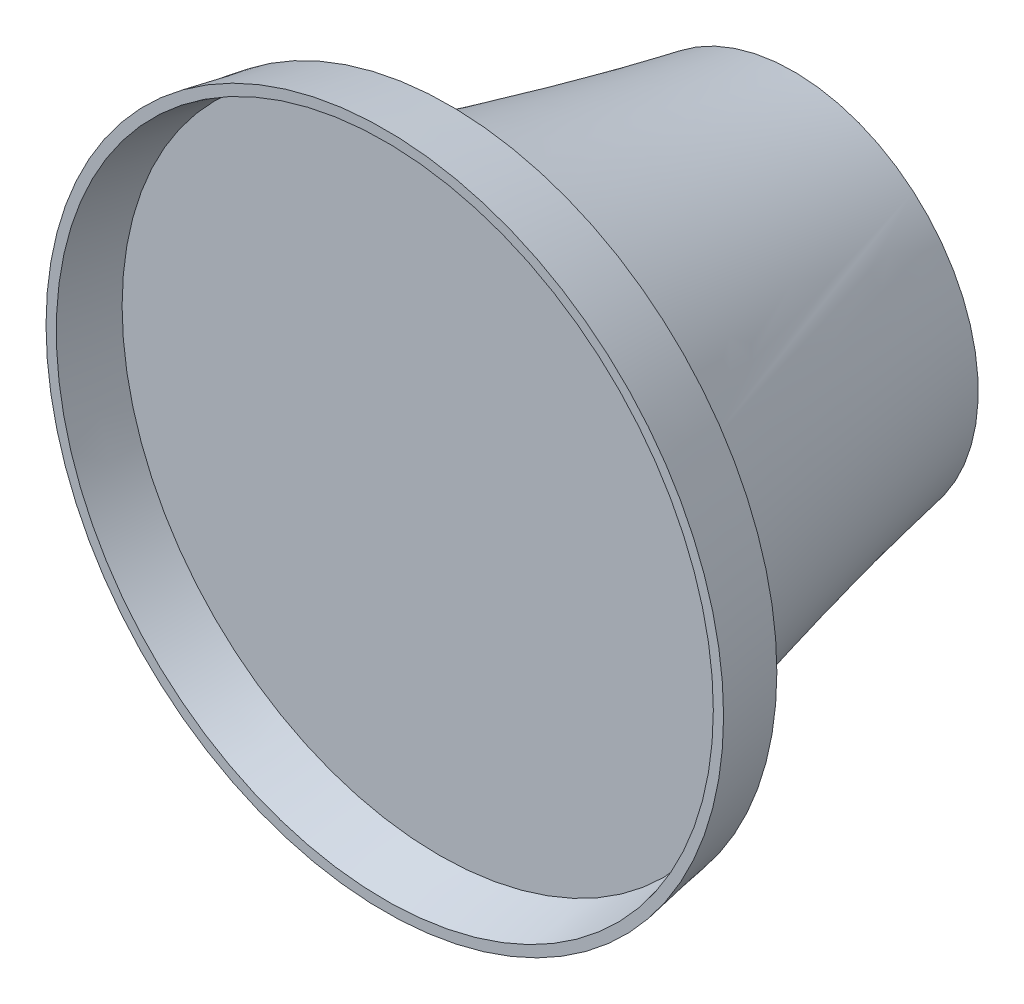
ISO-10303-21;
HEADER;
FILE_DESCRIPTION(('STEP AP214'),'2;1');
FILE_NAME('part.step','',(''),(''),'','','');
FILE_SCHEMA(('AUTOMOTIVE_DESIGN { 1 0 10303 214 1 1 1 1 }'));
ENDSEC;
DATA;
#1=APPLICATION_CONTEXT('core data for automotive mechanical design processes');
#2=APPLICATION_PROTOCOL_DEFINITION('international standard','automotive_design',2000,#1);
#3=PRODUCT_CONTEXT('',#1,'mechanical');
#4=PRODUCT('Part','Part','',(#3));
#5=PRODUCT_RELATED_PRODUCT_CATEGORY('part','',(#4));
#6=PRODUCT_DEFINITION_FORMATION('','',#4);
#7=PRODUCT_DEFINITION_CONTEXT('part definition',#1,'design');
#8=PRODUCT_DEFINITION('design','',#6,#7);
#9=PRODUCT_DEFINITION_SHAPE('','',#8);
#10=(LENGTH_UNIT() NAMED_UNIT(*) SI_UNIT(.MILLI.,.METRE.));
#11=(NAMED_UNIT(*) PLANE_ANGLE_UNIT() SI_UNIT($,.RADIAN.));
#12=(NAMED_UNIT(*) SI_UNIT($,.STERADIAN.) SOLID_ANGLE_UNIT());
#13=UNCERTAINTY_MEASURE_WITH_UNIT(LENGTH_MEASURE(1.E-05),#10,'distance_accuracy_value','');
#14=(GEOMETRIC_REPRESENTATION_CONTEXT(3) GLOBAL_UNCERTAINTY_ASSIGNED_CONTEXT((#13)) GLOBAL_UNIT_ASSIGNED_CONTEXT((#10,
#11,#12)) REPRESENTATION_CONTEXT('',''));
#15=CARTESIAN_POINT('',(0.,0.,0.));
#16=DIRECTION('',(0.,0.,1.));
#17=DIRECTION('',(1.,0.,0.));
#18=AXIS2_PLACEMENT_3D('',#15,#16,#17);
#19=CARTESIAN_POINT('',(-33.,0.,0.));
#20=DIRECTION('',(0.,0.,-1.));
#21=DIRECTION('',(-1.,0.,0.));
#22=AXIS2_PLACEMENT_3D('',#19,#20,#21);
#23=PLANE('',#22);
#24=CARTESIAN_POINT('',(0.,0.,0.));
#25=DIRECTION('',(0.,0.,1.));
#26=DIRECTION('',(1.,0.,0.));
#27=AXIS2_PLACEMENT_3D('',#24,#25,#26);
#28=CIRCLE('',#27,32.);
#29=CARTESIAN_POINT('',(32.,0.,0.));
#30=VERTEX_POINT('',#29);
#31=EDGE_CURVE('E65',#30,#30,#28,.T.);
#32=ORIENTED_EDGE('',*,*,#31,.F.);
#33=EDGE_LOOP('',(#32));
#34=FACE_BOUND('',#33,.T.);
#35=CARTESIAN_POINT('',(0.,0.,0.));
#36=DIRECTION('',(0.,0.,1.));
#37=DIRECTION('',(1.,0.,0.));
#38=AXIS2_PLACEMENT_3D('',#35,#36,#37);
#39=CIRCLE('',#38,33.);
#40=CARTESIAN_POINT('',(33.,0.,0.));
#41=VERTEX_POINT('',#40);
#42=EDGE_CURVE('E53',#41,#41,#39,.T.);
#43=ORIENTED_EDGE('',*,*,#42,.T.);
#44=EDGE_LOOP('',(#43));
#45=FACE_BOUND('',#44,.T.);
#46=ADVANCED_FACE('F45',(#34,#45),#23,.F.);
#47=CARTESIAN_POINT('',(0.,0.,-6.3));
#48=DIRECTION('',(0.,0.,1.));
#49=DIRECTION('',(1.,0.,0.));
#50=AXIS2_PLACEMENT_3D('',#47,#48,#49);
#51=CONICAL_SURFACE('',#50,31.8891400215367,0.17453292519943);
#52=ORIENTED_EDGE('',*,*,#42,.F.);
#53=EDGE_LOOP('',(#52));
#54=FACE_BOUND('',#53,.T.);
#55=CARTESIAN_POINT('',(0.,0.,-6.3));
#56=DIRECTION('',(0.,0.,1.));
#57=DIRECTION('',(1.,0.,0.));
#58=AXIS2_PLACEMENT_3D('',#55,#56,#57);
#59=CIRCLE('',#58,31.8891400215367);
#60=CARTESIAN_POINT('',(31.8891400215367,0.,-6.3));
#61=VERTEX_POINT('',#60);
#62=EDGE_CURVE('E59',#61,#61,#59,.T.);
#63=ORIENTED_EDGE('',*,*,#62,.T.);
#64=EDGE_LOOP('',(#63));
#65=FACE_BOUND('',#64,.T.);
#66=ADVANCED_FACE('F134',(#54,#65),#51,.T.);
#67=CARTESIAN_POINT('',(-30.8891400215367,0.,-6.3));
#68=DIRECTION('',(0.,0.,1.));
#69=DIRECTION('',(1.,0.,0.));
#70=AXIS2_PLACEMENT_3D('',#67,#68,#69);
#71=PLANE('',#70);
#72=CARTESIAN_POINT('',(0.,0.,-6.3));
#73=DIRECTION('',(0.,0.,-1.));
#74=DIRECTION('',(-1.,0.,0.));
#75=AXIS2_PLACEMENT_3D('',#72,#73,#74);
#76=CIRCLE('',#75,25.05);
#77=CARTESIAN_POINT('',(-25.05,0.,-6.3));
#78=VERTEX_POINT('',#77);
#79=EDGE_CURVE('E11',#78,#78,#76,.T.);
#80=ORIENTED_EDGE('',*,*,#79,.F.);
#81=EDGE_LOOP('',(#80));
#82=FACE_BOUND('',#81,.T.);
#83=ORIENTED_EDGE('',*,*,#62,.F.);
#84=EDGE_LOOP('',(#83));
#85=FACE_BOUND('',#84,.T.);
#86=ADVANCED_FACE('F131',(#82,#85),#71,.F.);
#87=CARTESIAN_POINT('',(0.,0.,-5.3));
#88=DIRECTION('',(0.,0.,-1.));
#89=DIRECTION('',(-1.,0.,0.));
#90=AXIS2_PLACEMENT_3D('',#87,#88,#89);
#91=PLANE('',#90);
#92=CARTESIAN_POINT('',(0.,0.,-5.3));
#93=DIRECTION('',(0.,0.,1.));
#94=DIRECTION('',(1.,0.,0.));
#95=AXIS2_PLACEMENT_3D('',#92,#93,#94);
#96=CIRCLE('',#95,30.8891400215367);
#97=CARTESIAN_POINT('',(30.8891400215367,0.,-5.3));
#98=VERTEX_POINT('',#97);
#99=EDGE_CURVE('E69',#98,#98,#96,.T.);
#100=ORIENTED_EDGE('',*,*,#99,.T.);
#101=EDGE_LOOP('',(#100));
#102=FACE_BOUND('',#101,.T.);
#103=ADVANCED_FACE('F127',(#102),#91,.F.);
#104=CARTESIAN_POINT('',(0.,0.,0.));
#105=DIRECTION('',(0.,0.,1.));
#106=DIRECTION('',(1.,0.,0.));
#107=AXIS2_PLACEMENT_3D('',#104,#105,#106);
#108=CONICAL_SURFACE('',#107,32.,0.206605439672846);
#109=ORIENTED_EDGE('',*,*,#99,.F.);
#110=EDGE_LOOP('',(#109));
#111=FACE_BOUND('',#110,.T.);
#112=ORIENTED_EDGE('',*,*,#31,.T.);
#113=EDGE_LOOP('',(#112));
#114=FACE_BOUND('',#113,.T.);
#115=ADVANCED_FACE('F123',(#111,#114),#108,.F.);
#116=CARTESIAN_POINT('',(0.,0.,-9.8));
#117=DIRECTION('',(0.,0.,1.));
#118=DIRECTION('',(1.,0.,0.));
#119=AXIS2_PLACEMENT_3D('',#116,#117,#118);
#120=CYLINDRICAL_SURFACE('',#119,25.05);
#121=CARTESIAN_POINT('',(0.,0.,-9.8));
#122=DIRECTION('',(0.,0.,1.));
#123=DIRECTION('',(1.,0.,0.));
#124=AXIS2_PLACEMENT_3D('',#121,#122,#123);
#125=CIRCLE('',#124,25.05);
#126=CARTESIAN_POINT('',(21.7747986758984,12.3838864103355,-9.8));
#127=VERTEX_POINT('',#126);
#128=EDGE_CURVE('E70',#127,#127,#125,.F.);
#129=ORIENTED_EDGE('',*,*,#128,.F.);
#130=EDGE_LOOP('',(#129));
#131=FACE_BOUND('',#130,.T.);
#132=ORIENTED_EDGE('',*,*,#79,.T.);
#133=EDGE_LOOP('',(#132));
#134=FACE_BOUND('',#133,.T.);
#135=ADVANCED_FACE('F101',(#131,#134),#120,.T.);
#136=CARTESIAN_POINT('',(0.,0.,-39.8));
#137=DIRECTION('',(0.,0.,-1.));
#138=DIRECTION('',(-1.,0.,0.));
#139=AXIS2_PLACEMENT_3D('',#136,#137,#138);
#140=PLANE('',#139);
#141=CARTESIAN_POINT('',(0.,0.,-39.8));
#142=DIRECTION('',(0.,0.,-1.));
#143=DIRECTION('',(-1.,0.,0.));
#144=AXIS2_PLACEMENT_3D('',#141,#142,#143);
#145=CIRCLE('',#144,18.);
#146=CARTESIAN_POINT('',(11.6642441509018,13.7093183050126,-39.8));
#147=VERTEX_POINT('',#146);
#148=EDGE_CURVE('E78',#147,#147,#145,.T.);
#149=ORIENTED_EDGE('',*,*,#148,.T.);
#150=EDGE_LOOP('',(#149));
#151=FACE_BOUND('',#150,.T.);
#152=ADVANCED_FACE('F91',(#151),#140,.T.);
#153=CARTESIAN_POINT('',(11.6642441509018,13.7093183050126,-39.8));
#154=CARTESIAN_POINT('',(21.7747986758984,12.3838864103355,-9.8));
#155=CARTESIAN_POINT('',(-15.7543924591234,37.0378066068161,-39.8));
#156=CARTESIAN_POINT('',(-2.99297414477261,55.9334837621323,-9.8));
#157=CARTESIAN_POINT('',(-39.082880760927,9.61916999679093,-39.8));
#158=CARTESIAN_POINT('',(-46.5425714965694,31.1657109414613,-9.8));
#159=CARTESIAN_POINT('',(-11.6642441509018,-13.7093183050126,-39.8));
#160=CARTESIAN_POINT('',(-21.7747986758984,-12.3838864103355,-9.8));
#161=CARTESIAN_POINT('',(15.7543924591234,-37.0378066068161,-39.8));
#162=CARTESIAN_POINT('',(2.99297414477263,-55.9334837621324,-9.8));
#163=CARTESIAN_POINT('',(39.0828807609269,-9.61916999679095,-39.8));
#164=CARTESIAN_POINT('',(46.5425714965695,-31.1657109414613,-9.8));
#165=CARTESIAN_POINT('',(11.6642441509018,13.7093183050126,-39.8));
#166=CARTESIAN_POINT('',(21.7747986758984,12.3838864103355,-9.8));
#167=(BOUNDED_SURFACE() B_SPLINE_SURFACE(3,1,((#153,#154),(#155,#156),(#157,#158),(#159,#160),
(#161,#162),(#163,#164),(#165,#166)),.UNSPECIFIED.,.T.,.F.,.F.) B_SPLINE_SURFACE_WITH_KNOTS((4,
3,4),(2,2),(0.,0.5,1.),(0.,1.),
.UNSPECIFIED.) GEOMETRIC_REPRESENTATION_ITEM() RATIONAL_B_SPLINE_SURFACE(((1.,1.),
(0.333333333333333,0.333333333333333),(0.333333333333333,0.333333333333333),(1.,1.),
(0.333333333333334,0.333333333333333),(0.333333333333334,0.333333333333333),(1.,1.))) REPRESENTATION_ITEM('') SURFACE());
#168=CARTESIAN_POINT('',(11.6642441509018,13.7093183050126,-39.8));
#169=CARTESIAN_POINT('',(11.7695624272038,13.6955117227764,-39.4875));
#170=CARTESIAN_POINT('',(11.8748807035059,13.6817051405402,-39.175));
#171=CARTESIAN_POINT('',(12.08551725611,13.6540919760677,-38.55));
#172=CARTESIAN_POINT('',(12.190835532412,13.6402853938315,-38.2375));
#173=CARTESIAN_POINT('',(12.4014720850161,13.6126722293591,-37.6125));
#174=CARTESIAN_POINT('',(12.5067903613182,13.5988656471228,-37.3));
#175=CARTESIAN_POINT('',(12.7174269139223,13.5712524826504,-36.675));
#176=CARTESIAN_POINT('',(12.8227451902243,13.5574459004142,-36.3625));
#177=CARTESIAN_POINT('',(13.0333817428284,13.5298327359418,-35.7375));
#178=CARTESIAN_POINT('',(13.1387000191304,13.5160261537055,-35.425));
#179=CARTESIAN_POINT('',(13.3493365717345,13.4884129892331,-34.8));
#180=CARTESIAN_POINT('',(13.4546548480366,13.4746064069969,-34.4875));
#181=CARTESIAN_POINT('',(13.6652914006407,13.4469932425244,-33.8625));
#182=CARTESIAN_POINT('',(13.7706096769427,13.4331866602882,-33.55));
#183=CARTESIAN_POINT('',(13.9812462295468,13.4055734958158,-32.925));
#184=CARTESIAN_POINT('',(14.0865645058489,13.3917669135796,-32.6125));
#185=CARTESIAN_POINT('',(14.297201058453,13.3641537491071,-31.9875));
#186=CARTESIAN_POINT('',(14.402519334755,13.3503471668709,-31.675));
#187=CARTESIAN_POINT('',(14.6131558873591,13.3227340023985,-31.05));
#188=CARTESIAN_POINT('',(14.7184741636612,13.3089274201622,-30.7375));
#189=CARTESIAN_POINT('',(14.9291107162653,13.2813142556898,-30.1125));
#190=CARTESIAN_POINT('',(15.0344289925673,13.2675076734536,-29.8));
#191=CARTESIAN_POINT('',(15.2450655451714,13.2398945089811,-29.175));
#192=CARTESIAN_POINT('',(15.3503838214735,13.2260879267449,-28.8625));
#193=CARTESIAN_POINT('',(15.5610203740776,13.1984747622725,-28.2375));
#194=CARTESIAN_POINT('',(15.6663386503796,13.1846681800363,-27.925));
#195=CARTESIAN_POINT('',(15.8769752029837,13.1570550155638,-27.3));
#196=CARTESIAN_POINT('',(15.9822934792858,13.1432484333276,-26.9875));
#197=CARTESIAN_POINT('',(16.1929300318899,13.1156352688552,-26.3625));
#198=CARTESIAN_POINT('',(16.2982483081919,13.1018286866189,-26.05));
#199=CARTESIAN_POINT('',(16.508884860796,13.0742155221465,-25.425));
#200=CARTESIAN_POINT('',(16.614203137098,13.0604089399103,-25.1125));
#201=CARTESIAN_POINT('',(16.8248396897021,13.0327957754378,-24.4875));
#202=CARTESIAN_POINT('',(16.9301579660042,13.0189891932016,-24.175));
#203=CARTESIAN_POINT('',(17.1407945186083,12.9913760287292,-23.55));
#204=CARTESIAN_POINT('',(17.2461127949103,12.977569446493,-23.2375));
#205=CARTESIAN_POINT('',(17.4567493475144,12.9499562820205,-22.6125));
#206=CARTESIAN_POINT('',(17.5620676238165,12.9361496997843,-22.3));
#207=CARTESIAN_POINT('',(17.7727041764206,12.9085365353119,-21.675));
#208=CARTESIAN_POINT('',(17.8780224527226,12.8947299530756,-21.3625));
#209=CARTESIAN_POINT('',(18.0886590053267,12.8671167886032,-20.7375));
#210=CARTESIAN_POINT('',(18.1939772816288,12.853310206367,-20.425));
#211=CARTESIAN_POINT('',(18.4046138342329,12.8256970418945,-19.8));
#212=CARTESIAN_POINT('',(18.5099321105349,12.8118904596583,-19.4875));
#213=CARTESIAN_POINT('',(18.720568663139,12.7842772951859,-18.8625));
#214=CARTESIAN_POINT('',(18.8258869394411,12.7704707129497,-18.55));
#215=CARTESIAN_POINT('',(19.0365234920452,12.7428575484772,-17.925));
#216=CARTESIAN_POINT('',(19.1418417683472,12.729050966241,-17.6125));
#217=CARTESIAN_POINT('',(19.3524783209513,12.7014378017686,-16.9875));
#218=CARTESIAN_POINT('',(19.4577965972533,12.6876312195323,-16.675));
#219=CARTESIAN_POINT('',(19.6684331498575,12.6600180550599,-16.05));
#220=CARTESIAN_POINT('',(19.7737514261595,12.6462114728237,-15.7375));
#221=CARTESIAN_POINT('',(19.9843879787636,12.6185983083512,-15.1125));
#222=CARTESIAN_POINT('',(20.0897062550656,12.604791726115,-14.8));
#223=CARTESIAN_POINT('',(20.3003428076697,12.5771785616426,-14.175));
#224=CARTESIAN_POINT('',(20.4056610839718,12.5633719794064,-13.8625));
#225=CARTESIAN_POINT('',(20.6162976365759,12.5357588149339,-13.2375));
#226=CARTESIAN_POINT('',(20.7216159128779,12.5219522326977,-12.925));
#227=CARTESIAN_POINT('',(20.932252465482,12.4943390682253,-12.3));
#228=CARTESIAN_POINT('',(21.0375707417841,12.4805324859891,-11.9875));
#229=CARTESIAN_POINT('',(21.2482072943882,12.4529193215166,-11.3625));
#230=CARTESIAN_POINT('',(21.3535255706902,12.4391127392804,-11.05));
#231=CARTESIAN_POINT('',(21.5641621232943,12.411499574808,-10.425));
#232=CARTESIAN_POINT('',(21.6694803995964,12.3976929925717,-10.1125));
#233=CARTESIAN_POINT('',(21.7747986758984,12.3838864103355,-9.8));
#234=B_SPLINE_CURVE_WITH_KNOTS('',3,(#168,#169,#170,#171,#172,#173,#174,#175,#176,#177,#178,
#179,#180,#181,#182,#183,#184,#185,#186,#187,#188,#189,#190,#191,#192,#193,#194,#195,#196,#197,
#198,#199,#200,#201,#202,#203,#204,#205,#206,#207,#208,#209,#210,#211,#212,#213,#214,#215,#216,
#217,#218,#219,#220,#221,#222,#223,#224,#225,#226,#227,#228,#229,#230,#231,#232,#233),
.UNSPECIFIED.,.F.,.F.,(4,2,2,2,2,2,2,2,2,2,2,2,2,2,2,2,2,2,2,2,2,2,2,2,2,2,2,2,2,2,2,2,4),(0.,
0.990176398085979,1.98035279617196,2.97052919425793,3.96070559234392,4.95088199042989,
5.94105838851587,6.93123478660184,7.92141118468782,8.9115875827738,9.90176398085978,
10.8919403789458,11.8821167770317,12.8722931751177,13.8624695732037,14.8526459712897,
15.8428223693756,16.8329987674616,17.8231751655476,18.8133515636336,19.8035279617196,
20.7937043598055,21.7838807578915,22.7740571559775,23.7642335540635,24.7544099521495,
25.7445863502354,26.7347627483214,27.7249391464074,28.7151155444934,29.7052919425793,
30.6954683406653,31.6856447387513),.UNSPECIFIED.);
#235=EDGE_CURVE('BSEAM100',#147,#127,#234,.T.);
#236=ORIENTED_EDGE('',*,*,#148,.F.);
#237=ORIENTED_EDGE('',*,*,#128,.T.);
#238=ORIENTED_EDGE('',*,*,#235,.T.);
#239=ORIENTED_EDGE('',*,*,#235,.F.);
#240=EDGE_LOOP('',(#236,#238,#237,#239));
#241=FACE_BOUND('',#240,.T.);
#242=ADVANCED_FACE('F100',(#241),#167,.T.);
#243=CLOSED_SHELL('',(#46,#66,#86,#103,#115,#135,#152,#242));
#244=MANIFOLD_SOLID_BREP('B2',#243);
#245=ADVANCED_BREP_SHAPE_REPRESENTATION('',(#18,#244),#14);
#246=SHAPE_DEFINITION_REPRESENTATION(#9,#245);
ENDSEC;
END-ISO-10303-21;
